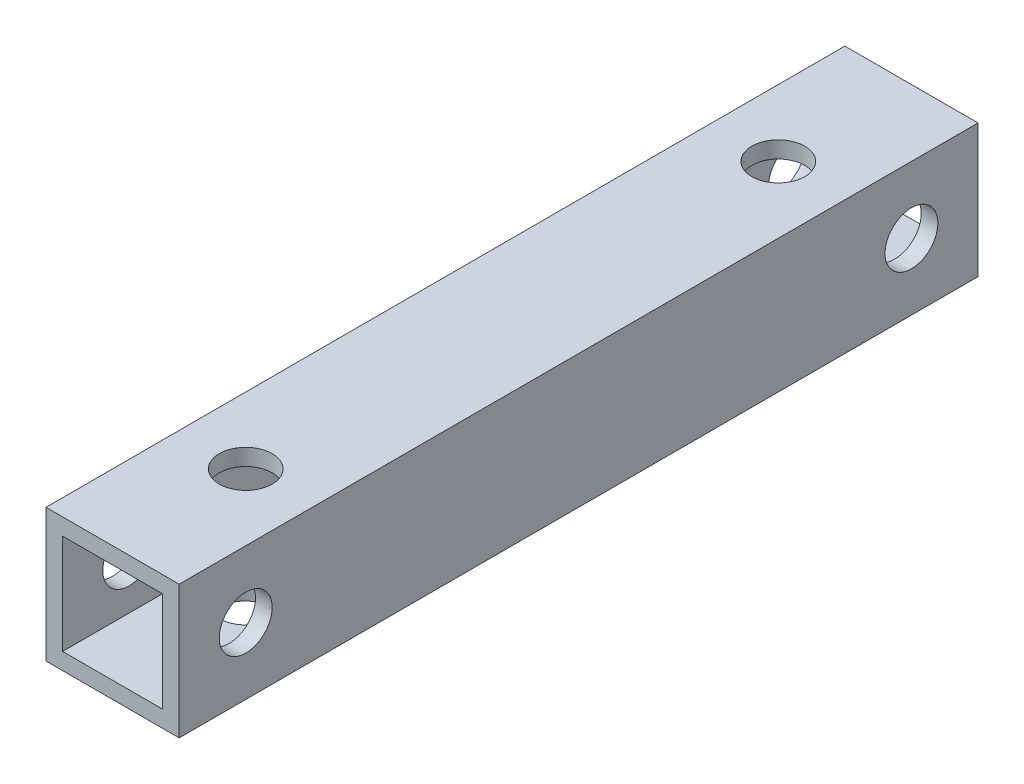
ISO-10303-21;
HEADER;
FILE_DESCRIPTION(('STEP AP214'),'2;1');
FILE_NAME('part.step','',(''),(''),'','','');
FILE_SCHEMA(('AUTOMOTIVE_DESIGN { 1 0 10303 214 1 1 1 1 }'));
ENDSEC;
DATA;
#1=APPLICATION_CONTEXT('core data for automotive mechanical design processes');
#2=APPLICATION_PROTOCOL_DEFINITION('international standard','automotive_design',2000,#1);
#3=PRODUCT_CONTEXT('',#1,'mechanical');
#4=PRODUCT('Part','Part','',(#3));
#5=PRODUCT_RELATED_PRODUCT_CATEGORY('part','',(#4));
#6=PRODUCT_DEFINITION_FORMATION('','',#4);
#7=PRODUCT_DEFINITION_CONTEXT('part definition',#1,'design');
#8=PRODUCT_DEFINITION('design','',#6,#7);
#9=PRODUCT_DEFINITION_SHAPE('','',#8);
#10=(LENGTH_UNIT() NAMED_UNIT(*) SI_UNIT(.MILLI.,.METRE.));
#11=(NAMED_UNIT(*) PLANE_ANGLE_UNIT() SI_UNIT($,.RADIAN.));
#12=(NAMED_UNIT(*) SI_UNIT($,.STERADIAN.) SOLID_ANGLE_UNIT());
#13=UNCERTAINTY_MEASURE_WITH_UNIT(LENGTH_MEASURE(1.E-05),#10,'distance_accuracy_value','');
#14=(GEOMETRIC_REPRESENTATION_CONTEXT(3) GLOBAL_UNCERTAINTY_ASSIGNED_CONTEXT((#13)) GLOBAL_UNIT_ASSIGNED_CONTEXT((#10,
#11,#12)) REPRESENTATION_CONTEXT('',''));
#15=CARTESIAN_POINT('',(0.,0.,0.));
#16=DIRECTION('',(0.,0.,1.));
#17=DIRECTION('',(1.,0.,0.));
#18=AXIS2_PLACEMENT_3D('',#15,#16,#17);
#19=CARTESIAN_POINT('',(12.7,12.7,-76.2));
#20=DIRECTION('',(1.,0.,0.));
#21=DIRECTION('',(0.,1.,0.));
#22=AXIS2_PLACEMENT_3D('',#19,#20,#21);
#23=PLANE('',#22);
#24=CARTESIAN_POINT('',(12.7,0.,-63.5));
#25=DIRECTION('',(1.,0.,0.));
#26=DIRECTION('',(0.,0.,-1.));
#27=AXIS2_PLACEMENT_3D('',#24,#25,#26);
#28=CIRCLE('',#27,5.0419);
#29=CARTESIAN_POINT('',(12.7,0.,-68.5419));
#30=VERTEX_POINT('',#29);
#31=EDGE_CURVE('E183',#30,#30,#28,.T.);
#32=ORIENTED_EDGE('',*,*,#31,.F.);
#33=EDGE_LOOP('',(#32));
#34=FACE_BOUND('',#33,.T.);
#35=CARTESIAN_POINT('',(12.7,0.,63.5));
#36=DIRECTION('',(1.,0.,0.));
#37=DIRECTION('',(0.,0.,-1.));
#38=AXIS2_PLACEMENT_3D('',#35,#36,#37);
#39=CIRCLE('',#38,5.0419);
#40=CARTESIAN_POINT('',(12.7,0.,58.4581));
#41=VERTEX_POINT('',#40);
#42=EDGE_CURVE('E198',#41,#41,#39,.T.);
#43=ORIENTED_EDGE('',*,*,#42,.F.);
#44=EDGE_LOOP('',(#43));
#45=FACE_BOUND('',#44,.T.);
#46=DIRECTION('',(0.,1.,0.));
#47=VECTOR('',#46,1.);
#48=CARTESIAN_POINT('',(12.7,12.7,76.2));
#49=LINE('',#48,#47);
#50=CARTESIAN_POINT('',(12.7,-12.7,76.2));
#51=VERTEX_POINT('',#50);
#52=CARTESIAN_POINT('',(12.7,12.7,76.2));
#53=VERTEX_POINT('',#52);
#54=EDGE_CURVE('E133',#51,#53,#49,.T.);
#55=ORIENTED_EDGE('',*,*,#54,.F.);
#56=DIRECTION('',(0.,0.,1.));
#57=VECTOR('',#56,1.);
#58=CARTESIAN_POINT('',(12.7,-12.7,-76.2));
#59=LINE('',#58,#57);
#60=CARTESIAN_POINT('',(12.7,-12.7,-76.2));
#61=VERTEX_POINT('',#60);
#62=EDGE_CURVE('E11',#61,#51,#59,.T.);
#63=ORIENTED_EDGE('',*,*,#62,.F.);
#64=DIRECTION('',(0.,1.,0.));
#65=VECTOR('',#64,1.);
#66=CARTESIAN_POINT('',(12.7,12.7,-76.2));
#67=LINE('',#66,#65);
#68=CARTESIAN_POINT('',(12.7,12.7,-76.2));
#69=VERTEX_POINT('',#68);
#70=EDGE_CURVE('E137',#61,#69,#67,.T.);
#71=ORIENTED_EDGE('',*,*,#70,.T.);
#72=DIRECTION('',(0.,0.,1.));
#73=VECTOR('',#72,1.);
#74=CARTESIAN_POINT('',(12.7,12.7,-76.2));
#75=LINE('',#74,#73);
#76=EDGE_CURVE('E150',#69,#53,#75,.T.);
#77=ORIENTED_EDGE('',*,*,#76,.T.);
#78=EDGE_LOOP('',(#55,#63,#71,#77));
#79=FACE_BOUND('',#78,.T.);
#80=ADVANCED_FACE('F32',(#34,#45,#79),#23,.T.);
#81=CARTESIAN_POINT('',(-12.7,-12.7,-76.2));
#82=DIRECTION('',(0.,-1.,0.));
#83=DIRECTION('',(0.,0.,-1.));
#84=AXIS2_PLACEMENT_3D('',#81,#82,#83);
#85=PLANE('',#84);
#86=CARTESIAN_POINT('',(0.,-12.7,-50.8));
#87=DIRECTION('',(0.,1.,0.));
#88=DIRECTION('',(0.,0.,1.));
#89=AXIS2_PLACEMENT_3D('',#86,#87,#88);
#90=CIRCLE('',#89,5.04189999999999);
#91=CARTESIAN_POINT('',(0.,-12.7,-45.7581));
#92=VERTEX_POINT('',#91);
#93=EDGE_CURVE('E306',#92,#92,#90,.T.);
#94=ORIENTED_EDGE('',*,*,#93,.T.);
#95=EDGE_LOOP('',(#94));
#96=FACE_BOUND('',#95,.T.);
#97=CARTESIAN_POINT('',(0.,-12.7,50.8));
#98=DIRECTION('',(0.,1.,0.));
#99=DIRECTION('',(0.,0.,1.));
#100=AXIS2_PLACEMENT_3D('',#97,#98,#99);
#101=CIRCLE('',#100,5.04189999999999);
#102=CARTESIAN_POINT('',(0.,-12.7,55.8419));
#103=VERTEX_POINT('',#102);
#104=EDGE_CURVE('E172',#103,#103,#101,.T.);
#105=ORIENTED_EDGE('',*,*,#104,.T.);
#106=EDGE_LOOP('',(#105));
#107=FACE_BOUND('',#106,.T.);
#108=DIRECTION('',(1.,0.,0.));
#109=VECTOR('',#108,1.);
#110=CARTESIAN_POINT('',(-12.7,-12.7,76.2));
#111=LINE('',#110,#109);
#112=CARTESIAN_POINT('',(-12.7,-12.7,76.2));
#113=VERTEX_POINT('',#112);
#114=EDGE_CURVE('E141',#113,#51,#111,.T.);
#115=ORIENTED_EDGE('',*,*,#114,.F.);
#116=DIRECTION('',(0.,0.,1.));
#117=VECTOR('',#116,1.);
#118=CARTESIAN_POINT('',(-12.7,-12.7,-76.2));
#119=LINE('',#118,#117);
#120=CARTESIAN_POINT('',(-12.7,-12.7,-76.2));
#121=VERTEX_POINT('',#120);
#122=EDGE_CURVE('E40',#121,#113,#119,.T.);
#123=ORIENTED_EDGE('',*,*,#122,.F.);
#124=DIRECTION('',(1.,0.,0.));
#125=VECTOR('',#124,1.);
#126=CARTESIAN_POINT('',(-12.7,-12.7,-76.2));
#127=LINE('',#126,#125);
#128=EDGE_CURVE('E147',#121,#61,#127,.T.);
#129=ORIENTED_EDGE('',*,*,#128,.T.);
#130=ORIENTED_EDGE('',*,*,#62,.T.);
#131=EDGE_LOOP('',(#115,#123,#129,#130));
#132=FACE_BOUND('',#131,.T.);
#133=ADVANCED_FACE('F236',(#96,#107,#132),#85,.T.);
#134=CARTESIAN_POINT('',(-12.7,12.7,-76.2));
#135=DIRECTION('',(-1.,0.,0.));
#136=DIRECTION('',(0.,-1.,0.));
#137=AXIS2_PLACEMENT_3D('',#134,#135,#136);
#138=PLANE('',#137);
#139=CARTESIAN_POINT('',(-12.7,0.,-63.5));
#140=DIRECTION('',(1.,0.,0.));
#141=DIRECTION('',(0.,0.,-1.));
#142=AXIS2_PLACEMENT_3D('',#139,#140,#141);
#143=CIRCLE('',#142,5.04189999999999);
#144=CARTESIAN_POINT('',(-12.7,0.,-68.5419));
#145=VERTEX_POINT('',#144);
#146=EDGE_CURVE('E176',#145,#145,#143,.T.);
#147=ORIENTED_EDGE('',*,*,#146,.T.);
#148=EDGE_LOOP('',(#147));
#149=FACE_BOUND('',#148,.T.);
#150=CARTESIAN_POINT('',(-12.7,0.,63.5));
#151=DIRECTION('',(1.,0.,0.));
#152=DIRECTION('',(0.,0.,-1.));
#153=AXIS2_PLACEMENT_3D('',#150,#151,#152);
#154=CIRCLE('',#153,5.04189999999999);
#155=CARTESIAN_POINT('',(-12.7,0.,58.4581));
#156=VERTEX_POINT('',#155);
#157=EDGE_CURVE('E168',#156,#156,#154,.T.);
#158=ORIENTED_EDGE('',*,*,#157,.T.);
#159=EDGE_LOOP('',(#158));
#160=FACE_BOUND('',#159,.T.);
#161=DIRECTION('',(0.,-1.,0.));
#162=VECTOR('',#161,1.);
#163=CARTESIAN_POINT('',(-12.7,12.7,76.2));
#164=LINE('',#163,#162);
#165=CARTESIAN_POINT('',(-12.7,12.7,76.2));
#166=VERTEX_POINT('',#165);
#167=EDGE_CURVE('E156',#166,#113,#164,.T.);
#168=ORIENTED_EDGE('',*,*,#167,.F.);
#169=DIRECTION('',(0.,0.,1.));
#170=VECTOR('',#169,1.);
#171=CARTESIAN_POINT('',(-12.7,12.7,-76.2));
#172=LINE('',#171,#170);
#173=CARTESIAN_POINT('',(-12.7,12.7,-76.2));
#174=VERTEX_POINT('',#173);
#175=EDGE_CURVE('E162',#174,#166,#172,.T.);
#176=ORIENTED_EDGE('',*,*,#175,.F.);
#177=DIRECTION('',(0.,-1.,0.));
#178=VECTOR('',#177,1.);
#179=CARTESIAN_POINT('',(-12.7,12.7,-76.2));
#180=LINE('',#179,#178);
#181=EDGE_CURVE('E144',#174,#121,#180,.T.);
#182=ORIENTED_EDGE('',*,*,#181,.T.);
#183=ORIENTED_EDGE('',*,*,#122,.T.);
#184=EDGE_LOOP('',(#168,#176,#182,#183));
#185=FACE_BOUND('',#184,.T.);
#186=ADVANCED_FACE('F203',(#149,#160,#185),#138,.T.);
#187=CARTESIAN_POINT('',(-12.7,12.7,-76.2));
#188=DIRECTION('',(0.,1.,0.));
#189=DIRECTION('',(0.,0.,1.));
#190=AXIS2_PLACEMENT_3D('',#187,#188,#189);
#191=PLANE('',#190);
#192=CARTESIAN_POINT('',(0.,12.7,-50.8));
#193=DIRECTION('',(0.,1.,0.));
#194=DIRECTION('',(0.,0.,1.));
#195=AXIS2_PLACEMENT_3D('',#192,#193,#194);
#196=CIRCLE('',#195,5.0419);
#197=CARTESIAN_POINT('',(0.,12.7,-45.7581));
#198=VERTEX_POINT('',#197);
#199=EDGE_CURVE('E309',#198,#198,#196,.T.);
#200=ORIENTED_EDGE('',*,*,#199,.F.);
#201=EDGE_LOOP('',(#200));
#202=FACE_BOUND('',#201,.T.);
#203=CARTESIAN_POINT('',(0.,12.7,50.8));
#204=DIRECTION('',(0.,1.,0.));
#205=DIRECTION('',(0.,0.,1.));
#206=AXIS2_PLACEMENT_3D('',#203,#204,#205);
#207=CIRCLE('',#206,5.0419);
#208=CARTESIAN_POINT('',(0.,12.7,55.8419));
#209=VERTEX_POINT('',#208);
#210=EDGE_CURVE('E180',#209,#209,#207,.T.);
#211=ORIENTED_EDGE('',*,*,#210,.F.);
#212=EDGE_LOOP('',(#211));
#213=FACE_BOUND('',#212,.T.);
#214=DIRECTION('',(-1.,0.,0.));
#215=VECTOR('',#214,1.);
#216=CARTESIAN_POINT('',(-12.7,12.7,76.2));
#217=LINE('',#216,#215);
#218=EDGE_CURVE('E153',#53,#166,#217,.T.);
#219=ORIENTED_EDGE('',*,*,#218,.F.);
#220=ORIENTED_EDGE('',*,*,#76,.F.);
#221=DIRECTION('',(-1.,0.,0.));
#222=VECTOR('',#221,1.);
#223=CARTESIAN_POINT('',(-12.7,12.7,-76.2));
#224=LINE('',#223,#222);
#225=EDGE_CURVE('E140',#69,#174,#224,.T.);
#226=ORIENTED_EDGE('',*,*,#225,.T.);
#227=ORIENTED_EDGE('',*,*,#175,.T.);
#228=EDGE_LOOP('',(#219,#220,#226,#227));
#229=FACE_BOUND('',#228,.T.);
#230=ADVANCED_FACE('F257',(#202,#213,#229),#191,.T.);
#231=CARTESIAN_POINT('',(12.7,-12.7,-76.2));
#232=DIRECTION('',(0.,0.,1.));
#233=DIRECTION('',(1.,0.,0.));
#234=AXIS2_PLACEMENT_3D('',#231,#232,#233);
#235=PLANE('',#234);
#236=DIRECTION('',(0.,-1.,0.));
#237=VECTOR('',#236,1.);
#238=CARTESIAN_POINT('',(-9.525,9.525,-76.2));
#239=LINE('',#238,#237);
#240=CARTESIAN_POINT('',(-9.525,9.525,-76.2));
#241=VERTEX_POINT('',#240);
#242=CARTESIAN_POINT('',(-9.525,-9.525,-76.2));
#243=VERTEX_POINT('',#242);
#244=EDGE_CURVE('E105',#241,#243,#239,.T.);
#245=ORIENTED_EDGE('',*,*,#244,.T.);
#246=DIRECTION('',(1.,0.,0.));
#247=VECTOR('',#246,1.);
#248=CARTESIAN_POINT('',(-9.525,-9.525,-76.2));
#249=LINE('',#248,#247);
#250=CARTESIAN_POINT('',(9.525,-9.525,-76.2));
#251=VERTEX_POINT('',#250);
#252=EDGE_CURVE('E99',#243,#251,#249,.T.);
#253=ORIENTED_EDGE('',*,*,#252,.T.);
#254=DIRECTION('',(0.,1.,0.));
#255=VECTOR('',#254,1.);
#256=CARTESIAN_POINT('',(9.525,-9.525,-76.2));
#257=LINE('',#256,#255);
#258=CARTESIAN_POINT('',(9.525,9.52499999999999,-76.2));
#259=VERTEX_POINT('',#258);
#260=EDGE_CURVE('E108',#251,#259,#257,.T.);
#261=ORIENTED_EDGE('',*,*,#260,.T.);
#262=DIRECTION('',(-1.,0.,0.));
#263=VECTOR('',#262,1.);
#264=CARTESIAN_POINT('',(9.525,9.525,-76.2));
#265=LINE('',#264,#263);
#266=EDGE_CURVE('E48',#259,#241,#265,.T.);
#267=ORIENTED_EDGE('',*,*,#266,.T.);
#268=EDGE_LOOP('',(#245,#253,#261,#267));
#269=FACE_BOUND('',#268,.T.);
#270=ORIENTED_EDGE('',*,*,#70,.F.);
#271=ORIENTED_EDGE('',*,*,#128,.F.);
#272=ORIENTED_EDGE('',*,*,#181,.F.);
#273=ORIENTED_EDGE('',*,*,#225,.F.);
#274=EDGE_LOOP('',(#270,#271,#272,#273));
#275=FACE_BOUND('',#274,.T.);
#276=ADVANCED_FACE('F112',(#269,#275),#235,.F.);
#277=CARTESIAN_POINT('',(12.7,-12.7,76.2));
#278=DIRECTION('',(0.,0.,1.));
#279=DIRECTION('',(1.,0.,0.));
#280=AXIS2_PLACEMENT_3D('',#277,#278,#279);
#281=PLANE('',#280);
#282=DIRECTION('',(1.,0.,0.));
#283=VECTOR('',#282,1.);
#284=CARTESIAN_POINT('',(-9.525,-9.525,76.2));
#285=LINE('',#284,#283);
#286=CARTESIAN_POINT('',(-9.525,-9.525,76.2));
#287=VERTEX_POINT('',#286);
#288=CARTESIAN_POINT('',(9.525,-9.525,76.2));
#289=VERTEX_POINT('',#288);
#290=EDGE_CURVE('E56',#287,#289,#285,.T.);
#291=ORIENTED_EDGE('',*,*,#290,.F.);
#292=DIRECTION('',(0.,-1.,0.));
#293=VECTOR('',#292,1.);
#294=CARTESIAN_POINT('',(-9.525,9.525,76.2));
#295=LINE('',#294,#293);
#296=CARTESIAN_POINT('',(-9.525,9.525,76.2));
#297=VERTEX_POINT('',#296);
#298=EDGE_CURVE('E115',#297,#287,#295,.T.);
#299=ORIENTED_EDGE('',*,*,#298,.F.);
#300=DIRECTION('',(-1.,0.,0.));
#301=VECTOR('',#300,1.);
#302=CARTESIAN_POINT('',(9.525,9.525,76.2));
#303=LINE('',#302,#301);
#304=CARTESIAN_POINT('',(9.525,9.525,76.2));
#305=VERTEX_POINT('',#304);
#306=EDGE_CURVE('E118',#305,#297,#303,.T.);
#307=ORIENTED_EDGE('',*,*,#306,.F.);
#308=DIRECTION('',(0.,1.,0.));
#309=VECTOR('',#308,1.);
#310=CARTESIAN_POINT('',(9.525,-9.525,76.2));
#311=LINE('',#310,#309);
#312=EDGE_CURVE('E127',#289,#305,#311,.T.);
#313=ORIENTED_EDGE('',*,*,#312,.F.);
#314=EDGE_LOOP('',(#291,#299,#307,#313));
#315=FACE_BOUND('',#314,.T.);
#316=ORIENTED_EDGE('',*,*,#54,.T.);
#317=ORIENTED_EDGE('',*,*,#218,.T.);
#318=ORIENTED_EDGE('',*,*,#167,.T.);
#319=ORIENTED_EDGE('',*,*,#114,.T.);
#320=EDGE_LOOP('',(#316,#317,#318,#319));
#321=FACE_BOUND('',#320,.T.);
#322=ADVANCED_FACE('F224',(#315,#321),#281,.T.);
#323=CARTESIAN_POINT('',(-9.525,-9.525,-76.2));
#324=DIRECTION('',(0.,-1.,0.));
#325=DIRECTION('',(0.,0.,-1.));
#326=AXIS2_PLACEMENT_3D('',#323,#324,#325);
#327=PLANE('',#326);
#328=CARTESIAN_POINT('',(0.,-9.525,-50.8));
#329=DIRECTION('',(0.,-1.,0.));
#330=DIRECTION('',(0.,0.,-1.));
#331=AXIS2_PLACEMENT_3D('',#328,#329,#330);
#332=CIRCLE('',#331,5.04189999999999);
#333=CARTESIAN_POINT('',(0.,-9.525,-55.8419));
#334=VERTEX_POINT('',#333);
#335=EDGE_CURVE('E188',#334,#334,#332,.T.);
#336=ORIENTED_EDGE('',*,*,#335,.T.);
#337=EDGE_LOOP('',(#336));
#338=FACE_BOUND('',#337,.T.);
#339=CARTESIAN_POINT('',(0.,-9.525,50.8));
#340=DIRECTION('',(0.,-1.,0.));
#341=DIRECTION('',(0.,0.,-1.));
#342=AXIS2_PLACEMENT_3D('',#339,#340,#341);
#343=CIRCLE('',#342,5.04189999999999);
#344=CARTESIAN_POINT('',(0.,-9.525,45.7581));
#345=VERTEX_POINT('',#344);
#346=EDGE_CURVE('E171',#345,#345,#343,.T.);
#347=ORIENTED_EDGE('',*,*,#346,.T.);
#348=EDGE_LOOP('',(#347));
#349=FACE_BOUND('',#348,.T.);
#350=ORIENTED_EDGE('',*,*,#290,.T.);
#351=DIRECTION('',(0.,0.,1.));
#352=VECTOR('',#351,1.);
#353=CARTESIAN_POINT('',(9.525,-9.525,-76.2));
#354=LINE('',#353,#352);
#355=EDGE_CURVE('E95',#251,#289,#354,.T.);
#356=ORIENTED_EDGE('',*,*,#355,.F.);
#357=ORIENTED_EDGE('',*,*,#252,.F.);
#358=DIRECTION('',(0.,0.,1.));
#359=VECTOR('',#358,1.);
#360=CARTESIAN_POINT('',(-9.525,-9.525,-76.2));
#361=LINE('',#360,#359);
#362=EDGE_CURVE('E131',#243,#287,#361,.T.);
#363=ORIENTED_EDGE('',*,*,#362,.T.);
#364=EDGE_LOOP('',(#350,#356,#357,#363));
#365=FACE_BOUND('',#364,.T.);
#366=ADVANCED_FACE('F97',(#338,#349,#365),#327,.F.);
#367=CARTESIAN_POINT('',(-9.525,9.525,-76.2));
#368=DIRECTION('',(-1.,0.,0.));
#369=DIRECTION('',(0.,-1.,0.));
#370=AXIS2_PLACEMENT_3D('',#367,#368,#369);
#371=PLANE('',#370);
#372=CARTESIAN_POINT('',(-9.525,0.,-63.5));
#373=DIRECTION('',(-1.,0.,0.));
#374=DIRECTION('',(0.,-1.,0.));
#375=AXIS2_PLACEMENT_3D('',#372,#373,#374);
#376=CIRCLE('',#375,5.04189999999999);
#377=CARTESIAN_POINT('',(-9.525,-5.0419,-63.5));
#378=VERTEX_POINT('',#377);
#379=EDGE_CURVE('E175',#378,#378,#376,.T.);
#380=ORIENTED_EDGE('',*,*,#379,.T.);
#381=EDGE_LOOP('',(#380));
#382=FACE_BOUND('',#381,.T.);
#383=CARTESIAN_POINT('',(-9.525,0.,63.5));
#384=DIRECTION('',(-1.,0.,0.));
#385=DIRECTION('',(0.,-1.,0.));
#386=AXIS2_PLACEMENT_3D('',#383,#384,#385);
#387=CIRCLE('',#386,5.04189999999999);
#388=CARTESIAN_POINT('',(-9.525,-5.0419,63.5));
#389=VERTEX_POINT('',#388);
#390=EDGE_CURVE('E121',#389,#389,#387,.T.);
#391=ORIENTED_EDGE('',*,*,#390,.T.);
#392=EDGE_LOOP('',(#391));
#393=FACE_BOUND('',#392,.T.);
#394=ORIENTED_EDGE('',*,*,#298,.T.);
#395=ORIENTED_EDGE('',*,*,#362,.F.);
#396=ORIENTED_EDGE('',*,*,#244,.F.);
#397=DIRECTION('',(0.,0.,1.));
#398=VECTOR('',#397,1.);
#399=CARTESIAN_POINT('',(-9.525,9.525,-76.2));
#400=LINE('',#399,#398);
#401=EDGE_CURVE('E134',#241,#297,#400,.T.);
#402=ORIENTED_EDGE('',*,*,#401,.T.);
#403=EDGE_LOOP('',(#394,#395,#396,#402));
#404=FACE_BOUND('',#403,.T.);
#405=ADVANCED_FACE('F215',(#382,#393,#404),#371,.F.);
#406=CARTESIAN_POINT('',(9.525,9.525,-76.2));
#407=DIRECTION('',(0.,1.,0.));
#408=DIRECTION('',(0.,0.,1.));
#409=AXIS2_PLACEMENT_3D('',#406,#407,#408);
#410=PLANE('',#409);
#411=CARTESIAN_POINT('',(0.,9.525,-50.8));
#412=DIRECTION('',(0.,1.,0.));
#413=DIRECTION('',(0.,0.,1.));
#414=AXIS2_PLACEMENT_3D('',#411,#412,#413);
#415=CIRCLE('',#414,5.04189999999999);
#416=CARTESIAN_POINT('',(0.,9.525,-45.7581));
#417=VERTEX_POINT('',#416);
#418=EDGE_CURVE('E35',#417,#417,#415,.T.);
#419=ORIENTED_EDGE('',*,*,#418,.T.);
#420=EDGE_LOOP('',(#419));
#421=FACE_BOUND('',#420,.T.);
#422=CARTESIAN_POINT('',(0.,9.525,50.8));
#423=DIRECTION('',(0.,1.,0.));
#424=DIRECTION('',(0.,0.,1.));
#425=AXIS2_PLACEMENT_3D('',#422,#423,#424);
#426=CIRCLE('',#425,5.04189999999999);
#427=CARTESIAN_POINT('',(0.,9.525,55.8419));
#428=VERTEX_POINT('',#427);
#429=EDGE_CURVE('E169',#428,#428,#426,.T.);
#430=ORIENTED_EDGE('',*,*,#429,.T.);
#431=EDGE_LOOP('',(#430));
#432=FACE_BOUND('',#431,.T.);
#433=ORIENTED_EDGE('',*,*,#306,.T.);
#434=ORIENTED_EDGE('',*,*,#401,.F.);
#435=ORIENTED_EDGE('',*,*,#266,.F.);
#436=DIRECTION('',(0.,0.,1.));
#437=VECTOR('',#436,1.);
#438=CARTESIAN_POINT('',(9.525,9.525,-76.2));
#439=LINE('',#438,#437);
#440=EDGE_CURVE('E104',#259,#305,#439,.T.);
#441=ORIENTED_EDGE('',*,*,#440,.T.);
#442=EDGE_LOOP('',(#433,#434,#435,#441));
#443=FACE_BOUND('',#442,.T.);
#444=ADVANCED_FACE('F218',(#421,#432,#443),#410,.F.);
#445=CARTESIAN_POINT('',(9.525,-9.525,-76.2));
#446=DIRECTION('',(1.,0.,0.));
#447=DIRECTION('',(0.,1.,0.));
#448=AXIS2_PLACEMENT_3D('',#445,#446,#447);
#449=PLANE('',#448);
#450=CARTESIAN_POINT('',(9.525,0.,-63.5));
#451=DIRECTION('',(1.,0.,0.));
#452=DIRECTION('',(0.,1.,0.));
#453=AXIS2_PLACEMENT_3D('',#450,#451,#452);
#454=CIRCLE('',#453,5.04189999999999);
#455=CARTESIAN_POINT('',(9.525,5.04189999999999,-63.5));
#456=VERTEX_POINT('',#455);
#457=EDGE_CURVE('E173',#456,#456,#454,.T.);
#458=ORIENTED_EDGE('',*,*,#457,.T.);
#459=EDGE_LOOP('',(#458));
#460=FACE_BOUND('',#459,.T.);
#461=CARTESIAN_POINT('',(9.525,0.,63.5));
#462=DIRECTION('',(1.,0.,0.));
#463=DIRECTION('',(0.,1.,0.));
#464=AXIS2_PLACEMENT_3D('',#461,#462,#463);
#465=CIRCLE('',#464,5.04189999999999);
#466=CARTESIAN_POINT('',(9.525,5.04189999999999,63.5));
#467=VERTEX_POINT('',#466);
#468=EDGE_CURVE('E165',#467,#467,#465,.T.);
#469=ORIENTED_EDGE('',*,*,#468,.T.);
#470=EDGE_LOOP('',(#469));
#471=FACE_BOUND('',#470,.T.);
#472=ORIENTED_EDGE('',*,*,#312,.T.);
#473=ORIENTED_EDGE('',*,*,#440,.F.);
#474=ORIENTED_EDGE('',*,*,#260,.F.);
#475=ORIENTED_EDGE('',*,*,#355,.T.);
#476=EDGE_LOOP('',(#472,#473,#474,#475));
#477=FACE_BOUND('',#476,.T.);
#478=ADVANCED_FACE('F109',(#460,#471,#477),#449,.F.);
#479=CARTESIAN_POINT('',(12.7,0.,63.5));
#480=DIRECTION('',(1.,0.,0.));
#481=DIRECTION('',(0.,0.,-1.));
#482=AXIS2_PLACEMENT_3D('',#479,#480,#481);
#483=CYLINDRICAL_SURFACE('',#482,5.04189999999999);
#484=ORIENTED_EDGE('',*,*,#42,.T.);
#485=EDGE_LOOP('',(#484));
#486=FACE_BOUND('',#485,.T.);
#487=ORIENTED_EDGE('',*,*,#468,.F.);
#488=EDGE_LOOP('',(#487));
#489=FACE_BOUND('',#488,.T.);
#490=ADVANCED_FACE('F210',(#486,#489),#483,.F.);
#491=ORIENTED_EDGE('',*,*,#157,.F.);
#492=EDGE_LOOP('',(#491));
#493=FACE_BOUND('',#492,.T.);
#494=ORIENTED_EDGE('',*,*,#390,.F.);
#495=EDGE_LOOP('',(#494));
#496=FACE_BOUND('',#495,.T.);
#497=ADVANCED_FACE('F206',(#493,#496),#483,.F.);
#498=CARTESIAN_POINT('',(0.,12.7,50.8));
#499=DIRECTION('',(0.,1.,0.));
#500=DIRECTION('',(0.,0.,1.));
#501=AXIS2_PLACEMENT_3D('',#498,#499,#500);
#502=CYLINDRICAL_SURFACE('',#501,5.04189999999999);
#503=ORIENTED_EDGE('',*,*,#210,.T.);
#504=EDGE_LOOP('',(#503));
#505=FACE_BOUND('',#504,.T.);
#506=ORIENTED_EDGE('',*,*,#429,.F.);
#507=EDGE_LOOP('',(#506));
#508=FACE_BOUND('',#507,.T.);
#509=ADVANCED_FACE('F209',(#505,#508),#502,.F.);
#510=ORIENTED_EDGE('',*,*,#104,.F.);
#511=EDGE_LOOP('',(#510));
#512=FACE_BOUND('',#511,.T.);
#513=ORIENTED_EDGE('',*,*,#346,.F.);
#514=EDGE_LOOP('',(#513));
#515=FACE_BOUND('',#514,.T.);
#516=ADVANCED_FACE('F278',(#512,#515),#502,.F.);
#517=CARTESIAN_POINT('',(12.7,0.,-63.5));
#518=DIRECTION('',(1.,0.,0.));
#519=DIRECTION('',(0.,0.,-1.));
#520=AXIS2_PLACEMENT_3D('',#517,#518,#519);
#521=CYLINDRICAL_SURFACE('',#520,5.04189999999999);
#522=ORIENTED_EDGE('',*,*,#31,.T.);
#523=EDGE_LOOP('',(#522));
#524=FACE_BOUND('',#523,.T.);
#525=ORIENTED_EDGE('',*,*,#457,.F.);
#526=EDGE_LOOP('',(#525));
#527=FACE_BOUND('',#526,.T.);
#528=ADVANCED_FACE('F280',(#524,#527),#521,.F.);
#529=ORIENTED_EDGE('',*,*,#146,.F.);
#530=EDGE_LOOP('',(#529));
#531=FACE_BOUND('',#530,.T.);
#532=ORIENTED_EDGE('',*,*,#379,.F.);
#533=EDGE_LOOP('',(#532));
#534=FACE_BOUND('',#533,.T.);
#535=ADVANCED_FACE('F287',(#531,#534),#521,.F.);
#536=CARTESIAN_POINT('',(0.,12.7,-50.8));
#537=DIRECTION('',(0.,1.,0.));
#538=DIRECTION('',(0.,0.,1.));
#539=AXIS2_PLACEMENT_3D('',#536,#537,#538);
#540=CYLINDRICAL_SURFACE('',#539,5.04189999999999);
#541=ORIENTED_EDGE('',*,*,#199,.T.);
#542=EDGE_LOOP('',(#541));
#543=FACE_BOUND('',#542,.T.);
#544=ORIENTED_EDGE('',*,*,#418,.F.);
#545=EDGE_LOOP('',(#544));
#546=FACE_BOUND('',#545,.T.);
#547=ADVANCED_FACE('F294',(#543,#546),#540,.F.);
#548=ORIENTED_EDGE('',*,*,#93,.F.);
#549=EDGE_LOOP('',(#548));
#550=FACE_BOUND('',#549,.T.);
#551=ORIENTED_EDGE('',*,*,#335,.F.);
#552=EDGE_LOOP('',(#551));
#553=FACE_BOUND('',#552,.T.);
#554=ADVANCED_FACE('F296',(#550,#553),#540,.F.);
#555=CLOSED_SHELL('',(#80,#133,#186,#230,#276,#322,#366,#405,#444,#478,#490,#497,#509,#516,#528,
#535,#547,#554));
#556=MANIFOLD_SOLID_BREP('B2',#555);
#557=ADVANCED_BREP_SHAPE_REPRESENTATION('',(#18,#556),#14);
#558=SHAPE_DEFINITION_REPRESENTATION(#9,#557);
ENDSEC;
END-ISO-10303-21;
